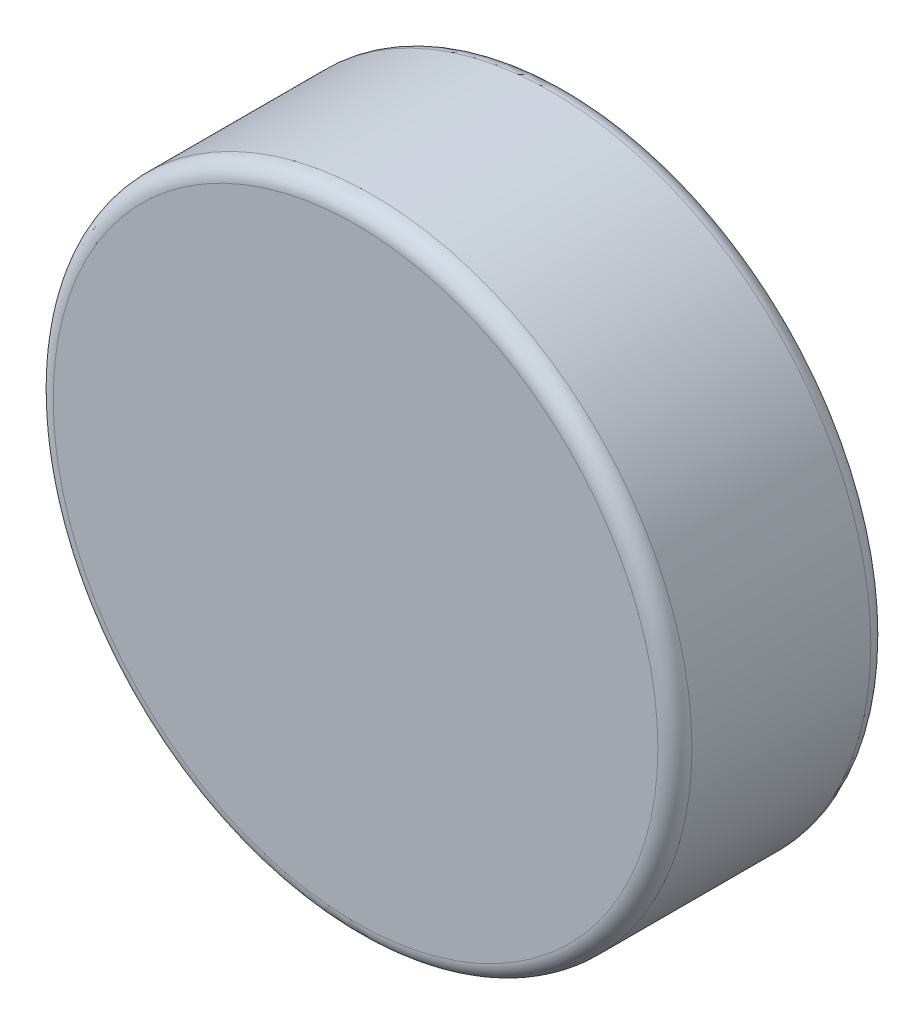
ISO-10303-21;
HEADER;
FILE_DESCRIPTION(('STEP AP214'),'2;1');
FILE_NAME('part.step','',(''),(''),'','','');
FILE_SCHEMA(('AUTOMOTIVE_DESIGN { 1 0 10303 214 1 1 1 1 }'));
ENDSEC;
DATA;
#1=APPLICATION_CONTEXT('core data for automotive mechanical design processes');
#2=APPLICATION_PROTOCOL_DEFINITION('international standard','automotive_design',2000,#1);
#3=PRODUCT_CONTEXT('',#1,'mechanical');
#4=PRODUCT('Part','Part','',(#3));
#5=PRODUCT_RELATED_PRODUCT_CATEGORY('part','',(#4));
#6=PRODUCT_DEFINITION_FORMATION('','',#4);
#7=PRODUCT_DEFINITION_CONTEXT('part definition',#1,'design');
#8=PRODUCT_DEFINITION('design','',#6,#7);
#9=PRODUCT_DEFINITION_SHAPE('','',#8);
#10=(LENGTH_UNIT() NAMED_UNIT(*) SI_UNIT(.MILLI.,.METRE.));
#11=(NAMED_UNIT(*) PLANE_ANGLE_UNIT() SI_UNIT($,.RADIAN.));
#12=(NAMED_UNIT(*) SI_UNIT($,.STERADIAN.) SOLID_ANGLE_UNIT());
#13=UNCERTAINTY_MEASURE_WITH_UNIT(LENGTH_MEASURE(1.E-05),#10,'distance_accuracy_value','');
#14=(GEOMETRIC_REPRESENTATION_CONTEXT(3) GLOBAL_UNCERTAINTY_ASSIGNED_CONTEXT((#13)) GLOBAL_UNIT_ASSIGNED_CONTEXT((#10,
#11,#12)) REPRESENTATION_CONTEXT('',''));
#15=CARTESIAN_POINT('',(0.,0.,0.));
#16=DIRECTION('',(0.,0.,1.));
#17=DIRECTION('',(1.,0.,0.));
#18=AXIS2_PLACEMENT_3D('',#15,#16,#17);
#19=CARTESIAN_POINT('',(0.,0.,0.79375));
#20=DIRECTION('',(0.,0.,-1.));
#21=DIRECTION('',(-1.,0.,0.));
#22=AXIS2_PLACEMENT_3D('',#19,#20,#21);
#23=CYLINDRICAL_SURFACE('',#22,2.38125);
#24=CARTESIAN_POINT('',(0.,0.,-0.66675));
#25=DIRECTION('',(0.,0.,1.));
#26=DIRECTION('',(1.,0.,0.));
#27=AXIS2_PLACEMENT_3D('',#24,#25,#26);
#28=CIRCLE('',#27,2.38125);
#29=CARTESIAN_POINT('',(-2.38125,0.,-0.66675));
#30=VERTEX_POINT('',#29);
#31=EDGE_CURVE('E41',#30,#30,#28,.T.);
#32=CARTESIAN_POINT('',(0.,0.,0.66675));
#33=DIRECTION('',(0.,0.,1.));
#34=DIRECTION('',(1.,0.,0.));
#35=AXIS2_PLACEMENT_3D('',#32,#33,#34);
#36=CIRCLE('',#35,2.38125);
#37=CARTESIAN_POINT('',(-2.38125,0.,0.66675));
#38=VERTEX_POINT('',#37);
#39=EDGE_CURVE('E45',#38,#38,#36,.F.);
#40=CARTESIAN_POINT('',(-2.38125,0.,-0.66675));
#41=CARTESIAN_POINT('',(-2.38125,0.,-0.652859375));
#42=CARTESIAN_POINT('',(-2.38125,0.,-0.63896875));
#43=CARTESIAN_POINT('',(-2.38125,0.,-0.6111875));
#44=CARTESIAN_POINT('',(-2.38125,0.,-0.597296875));
#45=CARTESIAN_POINT('',(-2.38125,0.,-0.569515625));
#46=CARTESIAN_POINT('',(-2.38125,0.,-0.555625));
#47=CARTESIAN_POINT('',(-2.38125,0.,-0.52784375));
#48=CARTESIAN_POINT('',(-2.38125,0.,-0.513953125));
#49=CARTESIAN_POINT('',(-2.38125,0.,-0.486171875));
#50=CARTESIAN_POINT('',(-2.38125,0.,-0.47228125));
#51=CARTESIAN_POINT('',(-2.38125,0.,-0.4445));
#52=CARTESIAN_POINT('',(-2.38125,0.,-0.430609375));
#53=CARTESIAN_POINT('',(-2.38125,0.,-0.402828125));
#54=CARTESIAN_POINT('',(-2.38125,0.,-0.3889375));
#55=CARTESIAN_POINT('',(-2.38125,0.,-0.36115625));
#56=CARTESIAN_POINT('',(-2.38125,0.,-0.347265625));
#57=CARTESIAN_POINT('',(-2.38125,0.,-0.319484375));
#58=CARTESIAN_POINT('',(-2.38125,0.,-0.30559375));
#59=CARTESIAN_POINT('',(-2.38125,0.,-0.2778125));
#60=CARTESIAN_POINT('',(-2.38125,0.,-0.263921875));
#61=CARTESIAN_POINT('',(-2.38125,0.,-0.236140625));
#62=CARTESIAN_POINT('',(-2.38125,0.,-0.22225));
#63=CARTESIAN_POINT('',(-2.38125,0.,-0.19446875));
#64=CARTESIAN_POINT('',(-2.38125,0.,-0.180578125));
#65=CARTESIAN_POINT('',(-2.38125,0.,-0.152796875));
#66=CARTESIAN_POINT('',(-2.38125,0.,-0.13890625));
#67=CARTESIAN_POINT('',(-2.38125,0.,-0.111125));
#68=CARTESIAN_POINT('',(-2.38125,0.,-0.0972343750000001));
#69=CARTESIAN_POINT('',(-2.38125,0.,-0.0694531250000001));
#70=CARTESIAN_POINT('',(-2.38125,0.,-0.0555625000000001));
#71=CARTESIAN_POINT('',(-2.38125,0.,-0.0277812500000001));
#72=CARTESIAN_POINT('',(-2.38125,0.,-0.0138906250000001));
#73=CARTESIAN_POINT('',(-2.38125,0.,0.0138906249999999));
#74=CARTESIAN_POINT('',(-2.38125,0.,0.0277812499999999));
#75=CARTESIAN_POINT('',(-2.38125,0.,0.0555624999999999));
#76=CARTESIAN_POINT('',(-2.38125,0.,0.0694531249999999));
#77=CARTESIAN_POINT('',(-2.38125,0.,0.0972343749999999));
#78=CARTESIAN_POINT('',(-2.38125,0.,0.111125));
#79=CARTESIAN_POINT('',(-2.38125,0.,0.13890625));
#80=CARTESIAN_POINT('',(-2.38125,0.,0.152796875));
#81=CARTESIAN_POINT('',(-2.38125,0.,0.180578125));
#82=CARTESIAN_POINT('',(-2.38125,0.,0.19446875));
#83=CARTESIAN_POINT('',(-2.38125,0.,0.22225));
#84=CARTESIAN_POINT('',(-2.38125,0.,0.236140625));
#85=CARTESIAN_POINT('',(-2.38125,0.,0.263921875));
#86=CARTESIAN_POINT('',(-2.38125,0.,0.2778125));
#87=CARTESIAN_POINT('',(-2.38125,0.,0.30559375));
#88=CARTESIAN_POINT('',(-2.38125,0.,0.319484375));
#89=CARTESIAN_POINT('',(-2.38125,0.,0.347265625));
#90=CARTESIAN_POINT('',(-2.38125,0.,0.36115625));
#91=CARTESIAN_POINT('',(-2.38125,0.,0.3889375));
#92=CARTESIAN_POINT('',(-2.38125,0.,0.402828125));
#93=CARTESIAN_POINT('',(-2.38125,0.,0.430609375));
#94=CARTESIAN_POINT('',(-2.38125,0.,0.4445));
#95=CARTESIAN_POINT('',(-2.38125,0.,0.47228125));
#96=CARTESIAN_POINT('',(-2.38125,0.,0.486171875));
#97=CARTESIAN_POINT('',(-2.38125,0.,0.513953125));
#98=CARTESIAN_POINT('',(-2.38125,0.,0.52784375));
#99=CARTESIAN_POINT('',(-2.38125,0.,0.555625));
#100=CARTESIAN_POINT('',(-2.38125,0.,0.569515625));
#101=CARTESIAN_POINT('',(-2.38125,0.,0.597296875));
#102=CARTESIAN_POINT('',(-2.38125,0.,0.6111875));
#103=CARTESIAN_POINT('',(-2.38125,0.,0.63896875));
#104=CARTESIAN_POINT('',(-2.38125,0.,0.652859375));
#105=CARTESIAN_POINT('',(-2.38125,0.,0.66675));
#106=B_SPLINE_CURVE_WITH_KNOTS('',3,(#40,#41,#42,#43,#44,#45,#46,#47,#48,#49,#50,#51,#52,#53,
#54,#55,#56,#57,#58,#59,#60,#61,#62,#63,#64,#65,#66,#67,#68,#69,#70,#71,#72,#73,#74,#75,#76,#77,
#78,#79,#80,#81,#82,#83,#84,#85,#86,#87,#88,#89,#90,#91,#92,#93,#94,#95,#96,#97,#98,#99,#100,
#101,#102,#103,#104,#105),.UNSPECIFIED.,.F.,.F.,(4,2,2,2,2,2,2,2,2,2,2,2,2,2,2,2,2,2,2,2,2,2,2,
2,2,2,2,2,2,2,2,2,4),(0.,0.041671875,0.0833437500000001,0.125015625,0.1666875,0.208359375,
0.25003125,0.291703125,0.333375,0.375046875,0.41671875,0.458390625,0.5000625,0.541734375,
0.58340625,0.625078125,0.66675,0.708421875,0.75009375,0.791765625,0.8334375,0.875109375,
0.91678125,0.958453125,1.000125,1.041796875,1.08346875,1.125140625,1.1668125,1.208484375,
1.25015625,1.291828125,1.3335),.UNSPECIFIED.);
#107=EDGE_CURVE('BSEAM30',#30,#38,#106,.T.);
#108=ORIENTED_EDGE('',*,*,#31,.T.);
#109=ORIENTED_EDGE('',*,*,#39,.T.);
#110=ORIENTED_EDGE('',*,*,#107,.T.);
#111=ORIENTED_EDGE('',*,*,#107,.F.);
#112=EDGE_LOOP('',(#108,#110,#109,#111));
#113=FACE_BOUND('',#112,.T.);
#114=ADVANCED_FACE('F30',(#113),#23,.T.);
#115=CARTESIAN_POINT('',(0.,0.,0.79375));
#116=DIRECTION('',(0.,0.,1.));
#117=DIRECTION('',(1.,0.,0.));
#118=AXIS2_PLACEMENT_3D('',#115,#116,#117);
#119=PLANE('',#118);
#120=CARTESIAN_POINT('',(0.,0.,0.79375));
#121=DIRECTION('',(0.,0.,1.));
#122=DIRECTION('',(1.,0.,0.));
#123=AXIS2_PLACEMENT_3D('',#120,#121,#122);
#124=CIRCLE('',#123,2.25425);
#125=CARTESIAN_POINT('',(2.25425,0.,0.79375));
#126=VERTEX_POINT('',#125);
#127=EDGE_CURVE('E10',#126,#126,#124,.T.);
#128=ORIENTED_EDGE('',*,*,#127,.T.);
#129=EDGE_LOOP('',(#128));
#130=FACE_BOUND('',#129,.T.);
#131=ADVANCED_FACE('F61',(#130),#119,.T.);
#132=CARTESIAN_POINT('',(0.,0.,-0.79375));
#133=DIRECTION('',(0.,0.,1.));
#134=DIRECTION('',(1.,0.,0.));
#135=AXIS2_PLACEMENT_3D('',#132,#133,#134);
#136=PLANE('',#135);
#137=CARTESIAN_POINT('',(0.,0.,-0.79375));
#138=DIRECTION('',(0.,0.,1.));
#139=DIRECTION('',(1.,0.,0.));
#140=AXIS2_PLACEMENT_3D('',#137,#138,#139);
#141=CIRCLE('',#140,2.25425);
#142=CARTESIAN_POINT('',(2.25425,0.,-0.79375));
#143=VERTEX_POINT('',#142);
#144=EDGE_CURVE('E37',#143,#143,#141,.F.);
#145=ORIENTED_EDGE('',*,*,#144,.T.);
#146=EDGE_LOOP('',(#145));
#147=FACE_BOUND('',#146,.T.);
#148=ADVANCED_FACE('F58',(#147),#136,.F.);
#149=CARTESIAN_POINT('',(0.,0.,-0.66675));
#150=DIRECTION('',(0.,0.,1.));
#151=DIRECTION('',(1.,0.,0.));
#152=AXIS2_PLACEMENT_3D('',#149,#150,#151);
#153=TOROIDAL_SURFACE('',#152,2.25425,0.127);
#154=ORIENTED_EDGE('',*,*,#144,.F.);
#155=EDGE_LOOP('',(#154));
#156=FACE_BOUND('',#155,.T.);
#157=ORIENTED_EDGE('',*,*,#31,.F.);
#158=EDGE_LOOP('',(#157));
#159=FACE_BOUND('',#158,.T.);
#160=ADVANCED_FACE('F54',(#156,#159),#153,.T.);
#161=CARTESIAN_POINT('',(0.,0.,0.66675));
#162=DIRECTION('',(0.,0.,1.));
#163=DIRECTION('',(1.,0.,0.));
#164=AXIS2_PLACEMENT_3D('',#161,#162,#163);
#165=TOROIDAL_SURFACE('',#164,2.25425,0.127);
#166=ORIENTED_EDGE('',*,*,#39,.F.);
#167=EDGE_LOOP('',(#166));
#168=FACE_BOUND('',#167,.T.);
#169=ORIENTED_EDGE('',*,*,#127,.F.);
#170=EDGE_LOOP('',(#169));
#171=FACE_BOUND('',#170,.T.);
#172=ADVANCED_FACE('F32',(#168,#171),#165,.T.);
#173=CLOSED_SHELL('',(#114,#131,#148,#160,#172));
#174=MANIFOLD_SOLID_BREP('B2',#173);
#175=ADVANCED_BREP_SHAPE_REPRESENTATION('',(#18,#174),#14);
#176=SHAPE_DEFINITION_REPRESENTATION(#9,#175);
ENDSEC;
END-ISO-10303-21;
